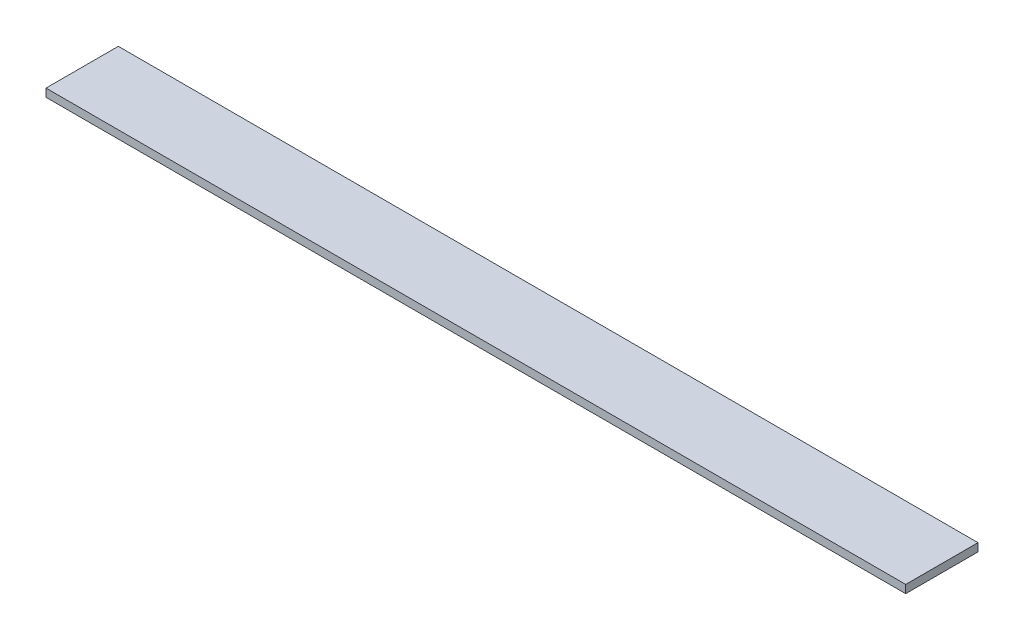
ISO-10303-21;
HEADER;
FILE_DESCRIPTION(('STEP AP214'),'2;1');
FILE_NAME('part.step','',(''),(''),'','','');
FILE_SCHEMA(('AUTOMOTIVE_DESIGN { 1 0 10303 214 1 1 1 1 }'));
ENDSEC;
DATA;
#1=APPLICATION_CONTEXT('core data for automotive mechanical design processes');
#2=APPLICATION_PROTOCOL_DEFINITION('international standard','automotive_design',2000,#1);
#3=PRODUCT_CONTEXT('',#1,'mechanical');
#4=PRODUCT('Part','Part','',(#3));
#5=PRODUCT_RELATED_PRODUCT_CATEGORY('part','',(#4));
#6=PRODUCT_DEFINITION_FORMATION('','',#4);
#7=PRODUCT_DEFINITION_CONTEXT('part definition',#1,'design');
#8=PRODUCT_DEFINITION('design','',#6,#7);
#9=PRODUCT_DEFINITION_SHAPE('','',#8);
#10=(LENGTH_UNIT() NAMED_UNIT(*) SI_UNIT(.MILLI.,.METRE.));
#11=(NAMED_UNIT(*) PLANE_ANGLE_UNIT() SI_UNIT($,.RADIAN.));
#12=(NAMED_UNIT(*) SI_UNIT($,.STERADIAN.) SOLID_ANGLE_UNIT());
#13=UNCERTAINTY_MEASURE_WITH_UNIT(LENGTH_MEASURE(1.E-05),#10,'distance_accuracy_value','');
#14=(GEOMETRIC_REPRESENTATION_CONTEXT(3) GLOBAL_UNCERTAINTY_ASSIGNED_CONTEXT((#13)) GLOBAL_UNIT_ASSIGNED_CONTEXT((#10,
#11,#12)) REPRESENTATION_CONTEXT('',''));
#15=CARTESIAN_POINT('',(0.,0.,0.));
#16=DIRECTION('',(0.,0.,1.));
#17=DIRECTION('',(1.,0.,0.));
#18=AXIS2_PLACEMENT_3D('',#15,#16,#17);
#19=CARTESIAN_POINT('',(-42.955,-4.74987113289998,-19.785));
#20=DIRECTION('',(0.,-1.,0.));
#21=DIRECTION('',(-1.,0.,0.));
#22=AXIS2_PLACEMENT_3D('',#19,#20,#21);
#23=PLANE('',#22);
#24=DIRECTION('',(0.,0.,-1.));
#25=VECTOR('',#24,1.);
#26=CARTESIAN_POINT('',(-69.705,-4.74987113289998,7.55));
#27=LINE('',#26,#25);
#28=CARTESIAN_POINT('',(-69.705,-4.74987113289998,-17.535));
#29=VERTEX_POINT('',#28);
#30=CARTESIAN_POINT('',(-69.705,-4.74987113289998,-22.035));
#31=VERTEX_POINT('',#30);
#32=EDGE_CURVE('E27',#29,#31,#27,.T.);
#33=ORIENTED_EDGE('',*,*,#32,.F.);
#34=DIRECTION('',(1.,0.,0.));
#35=VECTOR('',#34,1.);
#36=CARTESIAN_POINT('',(-123.205,-4.74987113289998,-17.535));
#37=LINE('',#36,#35);
#38=CARTESIAN_POINT('',(-16.205,-4.74987113289998,-17.535));
#39=VERTEX_POINT('',#38);
#40=EDGE_CURVE('E100',#29,#39,#37,.T.);
#41=ORIENTED_EDGE('',*,*,#40,.T.);
#42=DIRECTION('',(0.,0.,-1.));
#43=VECTOR('',#42,1.);
#44=CARTESIAN_POINT('',(-16.205,-4.74987113289998,-17.535));
#45=LINE('',#44,#43);
#46=CARTESIAN_POINT('',(-16.205,-4.74987113289998,-22.035));
#47=VERTEX_POINT('',#46);
#48=EDGE_CURVE('E90',#39,#47,#45,.T.);
#49=ORIENTED_EDGE('',*,*,#48,.T.);
#50=DIRECTION('',(-1.,0.,0.));
#51=VECTOR('',#50,1.);
#52=CARTESIAN_POINT('',(-16.205,-4.74987113289998,-22.035));
#53=LINE('',#52,#51);
#54=EDGE_CURVE('E67',#47,#31,#53,.T.);
#55=ORIENTED_EDGE('',*,*,#54,.T.);
#56=EDGE_LOOP('',(#33,#41,#49,#55));
#57=FACE_BOUND('',#56,.T.);
#58=ADVANCED_FACE('F16',(#57),#23,.F.);
#59=CARTESIAN_POINT('',(-42.955,-5.24987113289999,-19.785));
#60=DIRECTION('',(0.,-1.,0.));
#61=DIRECTION('',(0.,0.,-1.));
#62=AXIS2_PLACEMENT_3D('',#59,#60,#61);
#63=PLANE('',#62);
#64=DIRECTION('',(0.,0.,-1.));
#65=VECTOR('',#64,1.);
#66=CARTESIAN_POINT('',(-69.705,-5.24987113289999,7.55));
#67=LINE('',#66,#65);
#68=CARTESIAN_POINT('',(-69.705,-5.24987113289999,-17.535));
#69=VERTEX_POINT('',#68);
#70=CARTESIAN_POINT('',(-69.705,-5.24987113289999,-22.035));
#71=VERTEX_POINT('',#70);
#72=EDGE_CURVE('E11',#69,#71,#67,.T.);
#73=ORIENTED_EDGE('',*,*,#72,.T.);
#74=DIRECTION('',(1.,0.,0.));
#75=VECTOR('',#74,1.);
#76=CARTESIAN_POINT('',(-16.205,-5.24987113289999,-22.035));
#77=LINE('',#76,#75);
#78=CARTESIAN_POINT('',(-16.205,-5.24987113289999,-22.035));
#79=VERTEX_POINT('',#78);
#80=EDGE_CURVE('E72',#71,#79,#77,.T.);
#81=ORIENTED_EDGE('',*,*,#80,.T.);
#82=DIRECTION('',(0.,0.,1.));
#83=VECTOR('',#82,1.);
#84=CARTESIAN_POINT('',(-16.205,-5.24987113289999,-17.535));
#85=LINE('',#84,#83);
#86=CARTESIAN_POINT('',(-16.205,-5.24987113289999,-17.535));
#87=VERTEX_POINT('',#86);
#88=EDGE_CURVE('E75',#79,#87,#85,.T.);
#89=ORIENTED_EDGE('',*,*,#88,.T.);
#90=DIRECTION('',(-1.,0.,0.));
#91=VECTOR('',#90,1.);
#92=CARTESIAN_POINT('',(-123.205,-5.24987113289999,-17.535));
#93=LINE('',#92,#91);
#94=EDGE_CURVE('E20',#87,#69,#93,.T.);
#95=ORIENTED_EDGE('',*,*,#94,.T.);
#96=EDGE_LOOP('',(#73,#81,#89,#95));
#97=FACE_BOUND('',#96,.T.);
#98=ADVANCED_FACE('F73',(#97),#63,.T.);
#99=CARTESIAN_POINT('',(-69.705,-4.74987113289998,-17.535));
#100=DIRECTION('',(-1.,0.,0.));
#101=DIRECTION('',(0.,1.,0.));
#102=AXIS2_PLACEMENT_3D('',#99,#100,#101);
#103=PLANE('',#102);
#104=ORIENTED_EDGE('',*,*,#32,.T.);
#105=DIRECTION('',(0.,-1.,0.));
#106=VECTOR('',#105,1.);
#107=CARTESIAN_POINT('',(-69.705,-4.74987113289998,-22.035));
#108=LINE('',#107,#106);
#109=EDGE_CURVE('E78',#31,#71,#108,.T.);
#110=ORIENTED_EDGE('',*,*,#109,.T.);
#111=ORIENTED_EDGE('',*,*,#72,.F.);
#112=DIRECTION('',(0.,-1.,0.));
#113=VECTOR('',#112,1.);
#114=CARTESIAN_POINT('',(-69.705,-4.74987113289998,-17.535));
#115=LINE('',#114,#113);
#116=EDGE_CURVE('E104',#29,#69,#115,.T.);
#117=ORIENTED_EDGE('',*,*,#116,.F.);
#118=EDGE_LOOP('',(#104,#110,#111,#117));
#119=FACE_BOUND('',#118,.T.);
#120=ADVANCED_FACE('F120',(#119),#103,.T.);
#121=CARTESIAN_POINT('',(-69.705,-4.74987113289998,-22.035));
#122=DIRECTION('',(0.,0.,-1.));
#123=DIRECTION('',(0.,-1.,0.));
#124=AXIS2_PLACEMENT_3D('',#121,#122,#123);
#125=PLANE('',#124);
#126=ORIENTED_EDGE('',*,*,#54,.F.);
#127=DIRECTION('',(0.,-1.,0.));
#128=VECTOR('',#127,1.);
#129=CARTESIAN_POINT('',(-16.205,-4.74987113289998,-22.035));
#130=LINE('',#129,#128);
#131=EDGE_CURVE('E80',#47,#79,#130,.T.);
#132=ORIENTED_EDGE('',*,*,#131,.T.);
#133=ORIENTED_EDGE('',*,*,#80,.F.);
#134=ORIENTED_EDGE('',*,*,#109,.F.);
#135=EDGE_LOOP('',(#126,#132,#133,#134));
#136=FACE_BOUND('',#135,.T.);
#137=ADVANCED_FACE('F81',(#136),#125,.T.);
#138=CARTESIAN_POINT('',(-16.205,-4.74987113289998,-22.035));
#139=DIRECTION('',(1.,0.,0.));
#140=DIRECTION('',(0.,0.,-1.));
#141=AXIS2_PLACEMENT_3D('',#138,#139,#140);
#142=PLANE('',#141);
#143=ORIENTED_EDGE('',*,*,#48,.F.);
#144=DIRECTION('',(0.,-1.,0.));
#145=VECTOR('',#144,1.);
#146=CARTESIAN_POINT('',(-16.205,-4.74987113289998,-17.535));
#147=LINE('',#146,#145);
#148=EDGE_CURVE('E87',#39,#87,#147,.T.);
#149=ORIENTED_EDGE('',*,*,#148,.T.);
#150=ORIENTED_EDGE('',*,*,#88,.F.);
#151=ORIENTED_EDGE('',*,*,#131,.F.);
#152=EDGE_LOOP('',(#143,#149,#150,#151));
#153=FACE_BOUND('',#152,.T.);
#154=ADVANCED_FACE('F18',(#153),#142,.T.);
#155=CARTESIAN_POINT('',(-16.205,-4.74987113289998,-17.535));
#156=DIRECTION('',(0.,0.,1.));
#157=DIRECTION('',(1.,0.,0.));
#158=AXIS2_PLACEMENT_3D('',#155,#156,#157);
#159=PLANE('',#158);
#160=ORIENTED_EDGE('',*,*,#40,.F.);
#161=ORIENTED_EDGE('',*,*,#116,.T.);
#162=ORIENTED_EDGE('',*,*,#94,.F.);
#163=ORIENTED_EDGE('',*,*,#148,.F.);
#164=EDGE_LOOP('',(#160,#161,#162,#163));
#165=FACE_BOUND('',#164,.T.);
#166=ADVANCED_FACE('F117',(#165),#159,.T.);
#167=CLOSED_SHELL('',(#58,#98,#120,#137,#154,#166));
#168=MANIFOLD_SOLID_BREP('B1',#167);
#169=ADVANCED_BREP_SHAPE_REPRESENTATION('',(#18,#168),#14);
#170=SHAPE_DEFINITION_REPRESENTATION(#9,#169);
ENDSEC;
END-ISO-10303-21;
